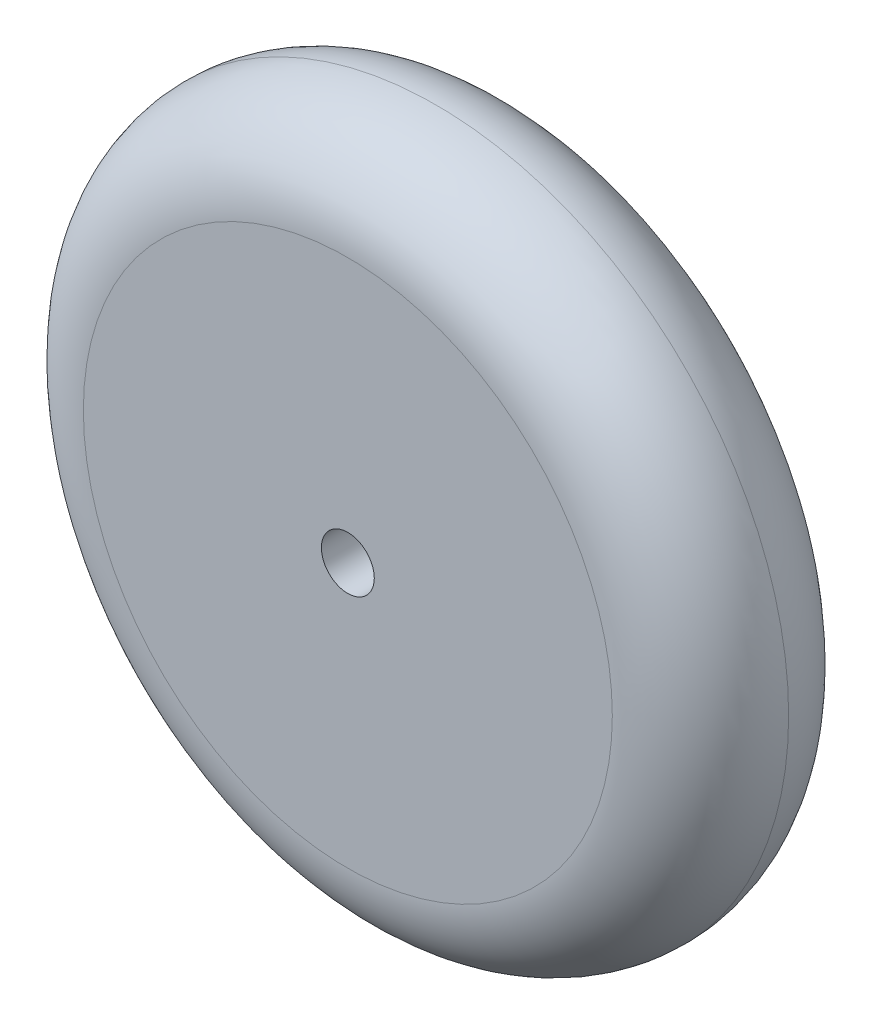
ISO-10303-21;
HEADER;
FILE_DESCRIPTION(('STEP AP214'),'2;1');
FILE_NAME('part.step','',(''),(''),'','','');
FILE_SCHEMA(('AUTOMOTIVE_DESIGN { 1 0 10303 214 1 1 1 1 }'));
ENDSEC;
DATA;
#1=APPLICATION_CONTEXT('core data for automotive mechanical design processes');
#2=APPLICATION_PROTOCOL_DEFINITION('international standard','automotive_design',2000,#1);
#3=PRODUCT_CONTEXT('',#1,'mechanical');
#4=PRODUCT('Part','Part','',(#3));
#5=PRODUCT_RELATED_PRODUCT_CATEGORY('part','',(#4));
#6=PRODUCT_DEFINITION_FORMATION('','',#4);
#7=PRODUCT_DEFINITION_CONTEXT('part definition',#1,'design');
#8=PRODUCT_DEFINITION('design','',#6,#7);
#9=PRODUCT_DEFINITION_SHAPE('','',#8);
#10=(LENGTH_UNIT() NAMED_UNIT(*) SI_UNIT(.MILLI.,.METRE.));
#11=(NAMED_UNIT(*) PLANE_ANGLE_UNIT() SI_UNIT($,.RADIAN.));
#12=(NAMED_UNIT(*) SI_UNIT($,.STERADIAN.) SOLID_ANGLE_UNIT());
#13=UNCERTAINTY_MEASURE_WITH_UNIT(LENGTH_MEASURE(1.E-05),#10,'distance_accuracy_value','');
#14=(GEOMETRIC_REPRESENTATION_CONTEXT(3) GLOBAL_UNCERTAINTY_ASSIGNED_CONTEXT((#13)) GLOBAL_UNIT_ASSIGNED_CONTEXT((#10,
#11,#12)) REPRESENTATION_CONTEXT('',''));
#15=CARTESIAN_POINT('',(0.,0.,0.));
#16=DIRECTION('',(0.,0.,1.));
#17=DIRECTION('',(1.,0.,0.));
#18=AXIS2_PLACEMENT_3D('',#15,#16,#17);
#19=CARTESIAN_POINT('',(0.,0.,10.));
#20=DIRECTION('',(0.,0.,1.));
#21=DIRECTION('',(1.,0.,0.));
#22=AXIS2_PLACEMENT_3D('',#19,#20,#21);
#23=PLANE('',#22);
#24=CARTESIAN_POINT('',(0.,0.,10.));
#25=DIRECTION('',(0.,0.,1.));
#26=DIRECTION('',(1.,0.,0.));
#27=AXIS2_PLACEMENT_3D('',#24,#25,#26);
#28=CIRCLE('',#27,1.5);
#29=CARTESIAN_POINT('',(1.5,0.,10.));
#30=VERTEX_POINT('',#29);
#31=EDGE_CURVE('E49',#30,#30,#28,.T.);
#32=ORIENTED_EDGE('',*,*,#31,.F.);
#33=EDGE_LOOP('',(#32));
#34=FACE_BOUND('',#33,.T.);
#35=CARTESIAN_POINT('',(0.,0.,10.));
#36=DIRECTION('',(0.,0.,1.));
#37=DIRECTION('',(1.,0.,0.));
#38=AXIS2_PLACEMENT_3D('',#35,#36,#37);
#39=CIRCLE('',#38,15.);
#40=CARTESIAN_POINT('',(15.,0.,10.));
#41=VERTEX_POINT('',#40);
#42=EDGE_CURVE('E42',#41,#41,#39,.T.);
#43=ORIENTED_EDGE('',*,*,#42,.T.);
#44=EDGE_LOOP('',(#43));
#45=FACE_BOUND('',#44,.T.);
#46=ADVANCED_FACE('F31',(#34,#45),#23,.T.);
#47=CARTESIAN_POINT('',(0.,0.,0.));
#48=DIRECTION('',(0.,0.,1.));
#49=DIRECTION('',(1.,0.,0.));
#50=AXIS2_PLACEMENT_3D('',#47,#48,#49);
#51=PLANE('',#50);
#52=CARTESIAN_POINT('',(0.,0.,0.));
#53=DIRECTION('',(0.,0.,1.));
#54=DIRECTION('',(1.,0.,0.));
#55=AXIS2_PLACEMENT_3D('',#52,#53,#54);
#56=CIRCLE('',#55,1.5);
#57=CARTESIAN_POINT('',(1.5,0.,0.));
#58=VERTEX_POINT('',#57);
#59=EDGE_CURVE('E46',#58,#58,#56,.T.);
#60=ORIENTED_EDGE('',*,*,#59,.T.);
#61=EDGE_LOOP('',(#60));
#62=FACE_BOUND('',#61,.T.);
#63=CARTESIAN_POINT('',(0.,0.,0.));
#64=DIRECTION('',(0.,0.,1.));
#65=DIRECTION('',(1.,0.,0.));
#66=AXIS2_PLACEMENT_3D('',#63,#64,#65);
#67=CIRCLE('',#66,15.);
#68=CARTESIAN_POINT('',(15.,0.,0.));
#69=VERTEX_POINT('',#68);
#70=EDGE_CURVE('E10',#69,#69,#67,.F.);
#71=ORIENTED_EDGE('',*,*,#70,.T.);
#72=EDGE_LOOP('',(#71));
#73=FACE_BOUND('',#72,.T.);
#74=ADVANCED_FACE('F55',(#62,#73),#51,.F.);
#75=CARTESIAN_POINT('',(0.,0.,5.));
#76=DIRECTION('',(0.,0.,1.));
#77=DIRECTION('',(1.,0.,0.));
#78=AXIS2_PLACEMENT_3D('',#75,#76,#77);
#79=TOROIDAL_SURFACE('',#78,15.,5.);
#80=CARTESIAN_POINT('',(0.,0.,5.));
#81=DIRECTION('',(0.,0.,1.));
#82=DIRECTION('',(1.,0.,0.));
#83=AXIS2_PLACEMENT_3D('',#80,#81,#82);
#84=CIRCLE('',#83,20.);
#85=CARTESIAN_POINT('',(20.,0.,5.));
#86=VERTEX_POINT('',#85);
#87=EDGE_CURVE('E38',#86,#86,#84,.F.);
#88=ORIENTED_EDGE('',*,*,#87,.F.);
#89=EDGE_LOOP('',(#88));
#90=FACE_BOUND('',#89,.T.);
#91=ORIENTED_EDGE('',*,*,#42,.F.);
#92=EDGE_LOOP('',(#91));
#93=FACE_BOUND('',#92,.T.);
#94=ADVANCED_FACE('F68',(#90,#93),#79,.T.);
#95=CARTESIAN_POINT('',(0.,0.,5.));
#96=DIRECTION('',(0.,0.,1.));
#97=DIRECTION('',(1.,0.,0.));
#98=AXIS2_PLACEMENT_3D('',#95,#96,#97);
#99=TOROIDAL_SURFACE('',#98,15.,5.);
#100=ORIENTED_EDGE('',*,*,#70,.F.);
#101=EDGE_LOOP('',(#100));
#102=FACE_BOUND('',#101,.T.);
#103=ORIENTED_EDGE('',*,*,#87,.T.);
#104=EDGE_LOOP('',(#103));
#105=FACE_BOUND('',#104,.T.);
#106=ADVANCED_FACE('F33',(#102,#105),#99,.T.);
#107=CARTESIAN_POINT('',(0.,0.,0.));
#108=DIRECTION('',(0.,0.,1.));
#109=DIRECTION('',(1.,0.,0.));
#110=AXIS2_PLACEMENT_3D('',#107,#108,#109);
#111=CYLINDRICAL_SURFACE('',#110,1.5);
#112=ORIENTED_EDGE('',*,*,#59,.F.);
#113=EDGE_LOOP('',(#112));
#114=FACE_BOUND('',#113,.T.);
#115=ORIENTED_EDGE('',*,*,#31,.T.);
#116=EDGE_LOOP('',(#115));
#117=FACE_BOUND('',#116,.T.);
#118=ADVANCED_FACE('F57',(#114,#117),#111,.F.);
#119=CLOSED_SHELL('',(#46,#74,#94,#106,#118));
#120=MANIFOLD_SOLID_BREP('B2',#119);
#121=ADVANCED_BREP_SHAPE_REPRESENTATION('',(#18,#120),#14);
#122=SHAPE_DEFINITION_REPRESENTATION(#9,#121);
ENDSEC;
END-ISO-10303-21;
